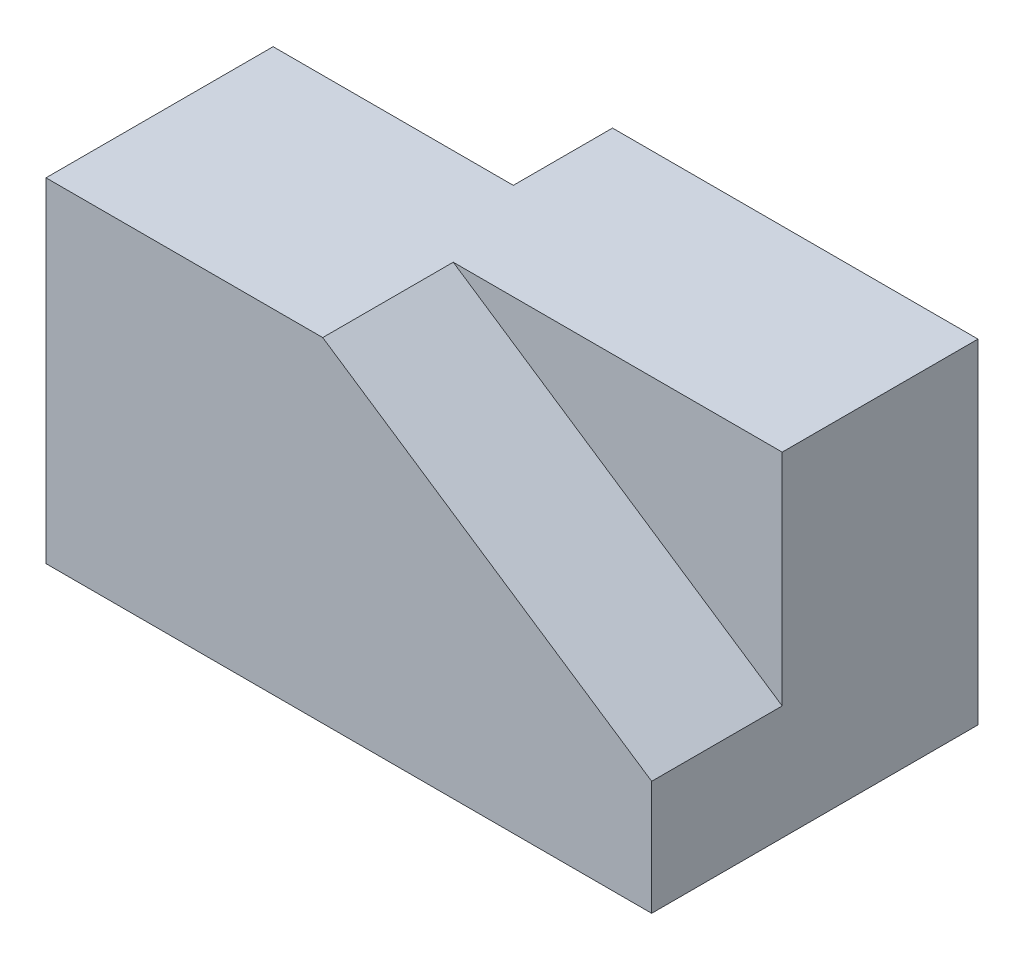
ISO-10303-21;
HEADER;
FILE_DESCRIPTION(('STEP AP214'),'2;1');
FILE_NAME('part.step','',(''),(''),'','','');
FILE_SCHEMA(('AUTOMOTIVE_DESIGN { 1 0 10303 214 1 1 1 1 }'));
ENDSEC;
DATA;
#1=APPLICATION_CONTEXT('core data for automotive mechanical design processes');
#2=APPLICATION_PROTOCOL_DEFINITION('international standard','automotive_design',2000,#1);
#3=PRODUCT_CONTEXT('',#1,'mechanical');
#4=PRODUCT('Part','Part','',(#3));
#5=PRODUCT_RELATED_PRODUCT_CATEGORY('part','',(#4));
#6=PRODUCT_DEFINITION_FORMATION('','',#4);
#7=PRODUCT_DEFINITION_CONTEXT('part definition',#1,'design');
#8=PRODUCT_DEFINITION('design','',#6,#7);
#9=PRODUCT_DEFINITION_SHAPE('','',#8);
#10=(LENGTH_UNIT() NAMED_UNIT(*) SI_UNIT(.MILLI.,.METRE.));
#11=(NAMED_UNIT(*) PLANE_ANGLE_UNIT() SI_UNIT($,.RADIAN.));
#12=(NAMED_UNIT(*) SI_UNIT($,.STERADIAN.) SOLID_ANGLE_UNIT());
#13=UNCERTAINTY_MEASURE_WITH_UNIT(LENGTH_MEASURE(1.E-05),#10,'distance_accuracy_value','');
#14=(GEOMETRIC_REPRESENTATION_CONTEXT(3) GLOBAL_UNCERTAINTY_ASSIGNED_CONTEXT((#13)) GLOBAL_UNIT_ASSIGNED_CONTEXT((#10,
#11,#12)) REPRESENTATION_CONTEXT('',''));
#15=CARTESIAN_POINT('',(0.,0.,0.));
#16=DIRECTION('',(0.,0.,1.));
#17=DIRECTION('',(1.,0.,0.));
#18=AXIS2_PLACEMENT_3D('',#15,#16,#17);
#19=CARTESIAN_POINT('',(0.,32.512,0.));
#20=DIRECTION('',(1.,0.,0.));
#21=DIRECTION('',(0.,0.,-1.));
#22=AXIS2_PLACEMENT_3D('',#19,#20,#21);
#23=PLANE('',#22);
#24=DIRECTION('',(0.,0.,1.));
#25=VECTOR('',#24,1.);
#26=CARTESIAN_POINT('',(0.,32.512,0.));
#27=LINE('',#26,#25);
#28=CARTESIAN_POINT('',(0.,32.512,-22.098));
#29=VERTEX_POINT('',#28);
#30=CARTESIAN_POINT('',(0.,32.512,0.));
#31=VERTEX_POINT('',#30);
#32=EDGE_CURVE('E123',#29,#31,#27,.T.);
#33=ORIENTED_EDGE('',*,*,#32,.F.);
#34=DIRECTION('',(0.,1.,0.));
#35=VECTOR('',#34,1.);
#36=CARTESIAN_POINT('',(0.,21.336,-22.098));
#37=LINE('',#36,#35);
#38=CARTESIAN_POINT('',(0.,21.336,-22.098));
#39=VERTEX_POINT('',#38);
#40=EDGE_CURVE('E46',#39,#29,#37,.T.);
#41=ORIENTED_EDGE('',*,*,#40,.F.);
#42=DIRECTION('',(0.,0.,1.));
#43=VECTOR('',#42,1.);
#44=CARTESIAN_POINT('',(0.,21.336,-31.75));
#45=LINE('',#44,#43);
#46=CARTESIAN_POINT('',(0.,21.336,-31.75));
#47=VERTEX_POINT('',#46);
#48=EDGE_CURVE('E111',#47,#39,#45,.T.);
#49=ORIENTED_EDGE('',*,*,#48,.F.);
#50=DIRECTION('',(0.,-1.,0.));
#51=VECTOR('',#50,1.);
#52=CARTESIAN_POINT('',(0.,32.512,-31.75));
#53=LINE('',#52,#51);
#54=CARTESIAN_POINT('',(0.,0.,-31.75));
#55=VERTEX_POINT('',#54);
#56=EDGE_CURVE('E153',#47,#55,#53,.T.);
#57=ORIENTED_EDGE('',*,*,#56,.T.);
#58=DIRECTION('',(0.,0.,1.));
#59=VECTOR('',#58,1.);
#60=CARTESIAN_POINT('',(0.,0.,0.));
#61=LINE('',#60,#59);
#62=CARTESIAN_POINT('',(0.,0.,0.));
#63=VERTEX_POINT('',#62);
#64=EDGE_CURVE('E141',#55,#63,#61,.T.);
#65=ORIENTED_EDGE('',*,*,#64,.T.);
#66=DIRECTION('',(0.,-1.,0.));
#67=VECTOR('',#66,1.);
#68=CARTESIAN_POINT('',(0.,32.512,0.));
#69=LINE('',#68,#67);
#70=EDGE_CURVE('E11',#31,#63,#69,.T.);
#71=ORIENTED_EDGE('',*,*,#70,.F.);
#72=EDGE_LOOP('',(#33,#41,#49,#57,#65,#71));
#73=FACE_BOUND('',#72,.T.);
#74=ADVANCED_FACE('F32',(#73),#23,.F.);
#75=CARTESIAN_POINT('',(0.,32.512,0.));
#76=DIRECTION('',(0.,0.,-1.));
#77=DIRECTION('',(-1.,0.,0.));
#78=AXIS2_PLACEMENT_3D('',#75,#76,#77);
#79=PLANE('',#78);
#80=DIRECTION('',(0.,-1.,0.));
#81=VECTOR('',#80,1.);
#82=CARTESIAN_POINT('',(58.928,32.512,0.));
#83=LINE('',#82,#81);
#84=CARTESIAN_POINT('',(58.928,11.1252,0.));
#85=VERTEX_POINT('',#84);
#86=CARTESIAN_POINT('',(58.928,0.,0.));
#87=VERTEX_POINT('',#86);
#88=EDGE_CURVE('E39',#85,#87,#83,.T.);
#89=ORIENTED_EDGE('',*,*,#88,.F.);
#90=DIRECTION('',(0.831440678638145,-0.555613532867713,0.));
#91=VECTOR('',#90,1.);
#92=CARTESIAN_POINT('',(26.924,32.512,0.));
#93=LINE('',#92,#91);
#94=CARTESIAN_POINT('',(26.924,32.512,0.));
#95=VERTEX_POINT('',#94);
#96=EDGE_CURVE('E133',#95,#85,#93,.T.);
#97=ORIENTED_EDGE('',*,*,#96,.F.);
#98=DIRECTION('',(1.,0.,0.));
#99=VECTOR('',#98,1.);
#100=CARTESIAN_POINT('',(0.,32.512,0.));
#101=LINE('',#100,#99);
#102=EDGE_CURVE('E144',#31,#95,#101,.T.);
#103=ORIENTED_EDGE('',*,*,#102,.F.);
#104=ORIENTED_EDGE('',*,*,#70,.T.);
#105=DIRECTION('',(1.,0.,0.));
#106=VECTOR('',#105,1.);
#107=CARTESIAN_POINT('',(0.,0.,0.));
#108=LINE('',#107,#106);
#109=EDGE_CURVE('E156',#63,#87,#108,.T.);
#110=ORIENTED_EDGE('',*,*,#109,.T.);
#111=EDGE_LOOP('',(#89,#97,#103,#104,#110));
#112=FACE_BOUND('',#111,.T.);
#113=ADVANCED_FACE('F173',(#112),#79,.F.);
#114=CARTESIAN_POINT('',(58.928,32.512,0.));
#115=DIRECTION('',(-1.,0.,0.));
#116=DIRECTION('',(0.,0.,1.));
#117=AXIS2_PLACEMENT_3D('',#114,#115,#116);
#118=PLANE('',#117);
#119=DIRECTION('',(0.,1.,0.));
#120=VECTOR('',#119,1.);
#121=CARTESIAN_POINT('',(58.928,11.1252,-12.7));
#122=LINE('',#121,#120);
#123=CARTESIAN_POINT('',(58.928,11.1252,-12.7));
#124=VERTEX_POINT('',#123);
#125=CARTESIAN_POINT('',(58.928,32.512,-12.7));
#126=VERTEX_POINT('',#125);
#127=EDGE_CURVE('E54',#124,#126,#122,.T.);
#128=ORIENTED_EDGE('',*,*,#127,.F.);
#129=DIRECTION('',(0.,0.,1.));
#130=VECTOR('',#129,1.);
#131=CARTESIAN_POINT('',(58.928,11.1252,-12.7));
#132=LINE('',#131,#130);
#133=EDGE_CURVE('E138',#124,#85,#132,.T.);
#134=ORIENTED_EDGE('',*,*,#133,.T.);
#135=ORIENTED_EDGE('',*,*,#88,.T.);
#136=DIRECTION('',(0.,0.,-1.));
#137=VECTOR('',#136,1.);
#138=CARTESIAN_POINT('',(58.928,0.,0.));
#139=LINE('',#138,#137);
#140=CARTESIAN_POINT('',(58.928,0.,-31.75));
#141=VERTEX_POINT('',#140);
#142=EDGE_CURVE('E159',#87,#141,#139,.T.);
#143=ORIENTED_EDGE('',*,*,#142,.T.);
#144=DIRECTION('',(0.,-1.,0.));
#145=VECTOR('',#144,1.);
#146=CARTESIAN_POINT('',(58.928,32.512,-31.75));
#147=LINE('',#146,#145);
#148=CARTESIAN_POINT('',(58.928,32.512,-31.75));
#149=VERTEX_POINT('',#148);
#150=EDGE_CURVE('E164',#149,#141,#147,.T.);
#151=ORIENTED_EDGE('',*,*,#150,.F.);
#152=DIRECTION('',(0.,0.,-1.));
#153=VECTOR('',#152,1.);
#154=CARTESIAN_POINT('',(58.928,32.512,0.));
#155=LINE('',#154,#153);
#156=EDGE_CURVE('E148',#126,#149,#155,.T.);
#157=ORIENTED_EDGE('',*,*,#156,.F.);
#158=EDGE_LOOP('',(#128,#134,#135,#143,#151,#157));
#159=FACE_BOUND('',#158,.T.);
#160=ADVANCED_FACE('F168',(#159),#118,.F.);
#161=CARTESIAN_POINT('',(0.,32.512,-31.75));
#162=DIRECTION('',(0.,0.,1.));
#163=DIRECTION('',(1.,0.,0.));
#164=AXIS2_PLACEMENT_3D('',#161,#162,#163);
#165=PLANE('',#164);
#166=DIRECTION('',(-1.,0.,0.));
#167=VECTOR('',#166,1.);
#168=CARTESIAN_POINT('',(0.,21.336,-31.75));
#169=LINE('',#168,#167);
#170=CARTESIAN_POINT('',(23.368,21.336,-31.75));
#171=VERTEX_POINT('',#170);
#172=EDGE_CURVE('E116',#171,#47,#169,.T.);
#173=ORIENTED_EDGE('',*,*,#172,.F.);
#174=DIRECTION('',(0.,1.,0.));
#175=VECTOR('',#174,1.);
#176=CARTESIAN_POINT('',(23.368,21.336,-31.75));
#177=LINE('',#176,#175);
#178=CARTESIAN_POINT('',(23.368,32.512,-31.75));
#179=VERTEX_POINT('',#178);
#180=EDGE_CURVE('E125',#171,#179,#177,.T.);
#181=ORIENTED_EDGE('',*,*,#180,.T.);
#182=DIRECTION('',(-1.,0.,0.));
#183=VECTOR('',#182,1.);
#184=CARTESIAN_POINT('',(0.,32.512,-31.75));
#185=LINE('',#184,#183);
#186=EDGE_CURVE('E150',#149,#179,#185,.T.);
#187=ORIENTED_EDGE('',*,*,#186,.F.);
#188=ORIENTED_EDGE('',*,*,#150,.T.);
#189=DIRECTION('',(-1.,0.,0.));
#190=VECTOR('',#189,1.);
#191=CARTESIAN_POINT('',(0.,0.,-31.75));
#192=LINE('',#191,#190);
#193=EDGE_CURVE('E145',#141,#55,#192,.T.);
#194=ORIENTED_EDGE('',*,*,#193,.T.);
#195=ORIENTED_EDGE('',*,*,#56,.F.);
#196=EDGE_LOOP('',(#173,#181,#187,#188,#194,#195));
#197=FACE_BOUND('',#196,.T.);
#198=ADVANCED_FACE('F180',(#197),#165,.F.);
#199=CARTESIAN_POINT('',(0.,32.512,0.));
#200=DIRECTION('',(0.,-1.,0.));
#201=DIRECTION('',(0.,0.,-1.));
#202=AXIS2_PLACEMENT_3D('',#199,#200,#201);
#203=PLANE('',#202);
#204=ORIENTED_EDGE('',*,*,#186,.T.);
#205=DIRECTION('',(0.,0.,-1.));
#206=VECTOR('',#205,1.);
#207=CARTESIAN_POINT('',(23.368,32.512,-31.75));
#208=LINE('',#207,#206);
#209=CARTESIAN_POINT('',(23.368,32.512,-22.098));
#210=VERTEX_POINT('',#209);
#211=EDGE_CURVE('E119',#210,#179,#208,.T.);
#212=ORIENTED_EDGE('',*,*,#211,.F.);
#213=DIRECTION('',(1.,0.,0.));
#214=VECTOR('',#213,1.);
#215=CARTESIAN_POINT('',(0.,32.512,-22.098));
#216=LINE('',#215,#214);
#217=EDGE_CURVE('E191',#29,#210,#216,.T.);
#218=ORIENTED_EDGE('',*,*,#217,.F.);
#219=ORIENTED_EDGE('',*,*,#32,.T.);
#220=ORIENTED_EDGE('',*,*,#102,.T.);
#221=DIRECTION('',(0.,0.,1.));
#222=VECTOR('',#221,1.);
#223=CARTESIAN_POINT('',(26.924,32.512,-12.7));
#224=LINE('',#223,#222);
#225=CARTESIAN_POINT('',(26.924,32.512,-12.7));
#226=VERTEX_POINT('',#225);
#227=EDGE_CURVE('E136',#226,#95,#224,.T.);
#228=ORIENTED_EDGE('',*,*,#227,.F.);
#229=DIRECTION('',(-1.,0.,0.));
#230=VECTOR('',#229,1.);
#231=CARTESIAN_POINT('',(58.928,32.512,-12.7));
#232=LINE('',#231,#230);
#233=EDGE_CURVE('E130',#126,#226,#232,.T.);
#234=ORIENTED_EDGE('',*,*,#233,.F.);
#235=ORIENTED_EDGE('',*,*,#156,.T.);
#236=EDGE_LOOP('',(#204,#212,#218,#219,#220,#228,#234,#235));
#237=FACE_BOUND('',#236,.T.);
#238=ADVANCED_FACE('F185',(#237),#203,.F.);
#239=CARTESIAN_POINT('',(0.,0.,0.));
#240=DIRECTION('',(0.,-1.,0.));
#241=DIRECTION('',(0.,0.,-1.));
#242=AXIS2_PLACEMENT_3D('',#239,#240,#241);
#243=PLANE('',#242);
#244=ORIENTED_EDGE('',*,*,#64,.F.);
#245=ORIENTED_EDGE('',*,*,#193,.F.);
#246=ORIENTED_EDGE('',*,*,#142,.F.);
#247=ORIENTED_EDGE('',*,*,#109,.F.);
#248=EDGE_LOOP('',(#244,#245,#246,#247));
#249=FACE_BOUND('',#248,.T.);
#250=ADVANCED_FACE('F178',(#249),#243,.T.);
#251=CARTESIAN_POINT('',(26.924,32.512,-12.7));
#252=DIRECTION('',(-0.555613532867713,-0.831440678638145,0.));
#253=DIRECTION('',(0.831440678638145,-0.555613532867713,0.));
#254=AXIS2_PLACEMENT_3D('',#251,#252,#253);
#255=PLANE('',#254);
#256=ORIENTED_EDGE('',*,*,#96,.T.);
#257=ORIENTED_EDGE('',*,*,#133,.F.);
#258=DIRECTION('',(0.831440678638145,-0.555613532867713,0.));
#259=VECTOR('',#258,1.);
#260=CARTESIAN_POINT('',(26.924,32.512,-12.7));
#261=LINE('',#260,#259);
#262=EDGE_CURVE('E132',#226,#124,#261,.T.);
#263=ORIENTED_EDGE('',*,*,#262,.F.);
#264=ORIENTED_EDGE('',*,*,#227,.T.);
#265=EDGE_LOOP('',(#256,#257,#263,#264));
#266=FACE_BOUND('',#265,.T.);
#267=ADVANCED_FACE('F190',(#266),#255,.F.);
#268=CARTESIAN_POINT('',(0.,0.,-12.7));
#269=DIRECTION('',(0.,0.,-1.));
#270=DIRECTION('',(-1.,0.,0.));
#271=AXIS2_PLACEMENT_3D('',#268,#269,#270);
#272=PLANE('',#271);
#273=ORIENTED_EDGE('',*,*,#233,.T.);
#274=ORIENTED_EDGE('',*,*,#262,.T.);
#275=ORIENTED_EDGE('',*,*,#127,.T.);
#276=EDGE_LOOP('',(#273,#274,#275));
#277=FACE_BOUND('',#276,.T.);
#278=ADVANCED_FACE('F188',(#277),#272,.F.);
#279=CARTESIAN_POINT('',(23.368,21.336,-31.75));
#280=DIRECTION('',(1.,0.,0.));
#281=DIRECTION('',(0.,0.,-1.));
#282=AXIS2_PLACEMENT_3D('',#279,#280,#281);
#283=PLANE('',#282);
#284=ORIENTED_EDGE('',*,*,#211,.T.);
#285=ORIENTED_EDGE('',*,*,#180,.F.);
#286=DIRECTION('',(0.,0.,-1.));
#287=VECTOR('',#286,1.);
#288=CARTESIAN_POINT('',(23.368,21.336,-31.75));
#289=LINE('',#288,#287);
#290=CARTESIAN_POINT('',(23.368,21.336,-22.098));
#291=VERTEX_POINT('',#290);
#292=EDGE_CURVE('E110',#291,#171,#289,.T.);
#293=ORIENTED_EDGE('',*,*,#292,.F.);
#294=DIRECTION('',(0.,1.,0.));
#295=VECTOR('',#294,1.);
#296=CARTESIAN_POINT('',(23.368,21.336,-22.098));
#297=LINE('',#296,#295);
#298=EDGE_CURVE('E106',#291,#210,#297,.T.);
#299=ORIENTED_EDGE('',*,*,#298,.T.);
#300=EDGE_LOOP('',(#284,#285,#293,#299));
#301=FACE_BOUND('',#300,.T.);
#302=ADVANCED_FACE('F196',(#301),#283,.F.);
#303=CARTESIAN_POINT('',(0.,21.336,-22.098));
#304=DIRECTION('',(0.,0.,1.));
#305=DIRECTION('',(1.,0.,0.));
#306=AXIS2_PLACEMENT_3D('',#303,#304,#305);
#307=PLANE('',#306);
#308=ORIENTED_EDGE('',*,*,#217,.T.);
#309=ORIENTED_EDGE('',*,*,#298,.F.);
#310=DIRECTION('',(1.,0.,0.));
#311=VECTOR('',#310,1.);
#312=CARTESIAN_POINT('',(0.,21.336,-22.098));
#313=LINE('',#312,#311);
#314=EDGE_CURVE('E103',#39,#291,#313,.T.);
#315=ORIENTED_EDGE('',*,*,#314,.F.);
#316=ORIENTED_EDGE('',*,*,#40,.T.);
#317=EDGE_LOOP('',(#308,#309,#315,#316));
#318=FACE_BOUND('',#317,.T.);
#319=ADVANCED_FACE('F105',(#318),#307,.F.);
#320=CARTESIAN_POINT('',(0.,21.336,0.));
#321=DIRECTION('',(0.,1.,0.));
#322=DIRECTION('',(0.,0.,1.));
#323=AXIS2_PLACEMENT_3D('',#320,#321,#322);
#324=PLANE('',#323);
#325=ORIENTED_EDGE('',*,*,#48,.T.);
#326=ORIENTED_EDGE('',*,*,#314,.T.);
#327=ORIENTED_EDGE('',*,*,#292,.T.);
#328=ORIENTED_EDGE('',*,*,#172,.T.);
#329=EDGE_LOOP('',(#325,#326,#327,#328));
#330=FACE_BOUND('',#329,.T.);
#331=ADVANCED_FACE('F114',(#330),#324,.T.);
#332=CLOSED_SHELL('',(#74,#113,#160,#198,#238,#250,#267,#278,#302,#319,#331));
#333=MANIFOLD_SOLID_BREP('B2',#332);
#334=ADVANCED_BREP_SHAPE_REPRESENTATION('',(#18,#333),#14);
#335=SHAPE_DEFINITION_REPRESENTATION(#9,#334);
ENDSEC;
END-ISO-10303-21;
